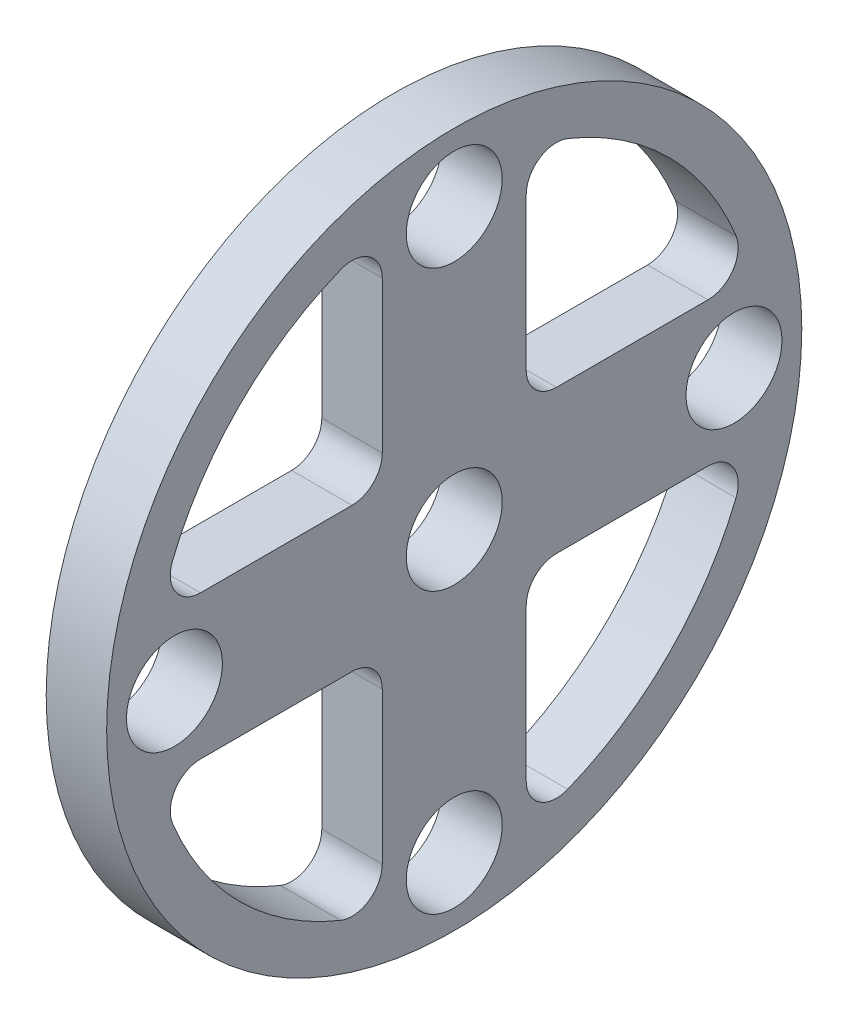
ISO-10303-21;
HEADER;
FILE_DESCRIPTION(('STEP AP214'),'2;1');
FILE_NAME('part.step','',(''),(''),'','','');
FILE_SCHEMA(('AUTOMOTIVE_DESIGN { 1 0 10303 214 1 1 1 1 }'));
ENDSEC;
DATA;
#1=APPLICATION_CONTEXT('core data for automotive mechanical design processes');
#2=APPLICATION_PROTOCOL_DEFINITION('international standard','automotive_design',2000,#1);
#3=PRODUCT_CONTEXT('',#1,'mechanical');
#4=PRODUCT('Part','Part','',(#3));
#5=PRODUCT_RELATED_PRODUCT_CATEGORY('part','',(#4));
#6=PRODUCT_DEFINITION_FORMATION('','',#4);
#7=PRODUCT_DEFINITION_CONTEXT('part definition',#1,'design');
#8=PRODUCT_DEFINITION('design','',#6,#7);
#9=PRODUCT_DEFINITION_SHAPE('','',#8);
#10=(LENGTH_UNIT() NAMED_UNIT(*) SI_UNIT(.MILLI.,.METRE.));
#11=(NAMED_UNIT(*) PLANE_ANGLE_UNIT() SI_UNIT($,.RADIAN.));
#12=(NAMED_UNIT(*) SI_UNIT($,.STERADIAN.) SOLID_ANGLE_UNIT());
#13=UNCERTAINTY_MEASURE_WITH_UNIT(LENGTH_MEASURE(1.E-05),#10,'distance_accuracy_value','');
#14=(GEOMETRIC_REPRESENTATION_CONTEXT(3) GLOBAL_UNCERTAINTY_ASSIGNED_CONTEXT((#13)) GLOBAL_UNIT_ASSIGNED_CONTEXT((#10,
#11,#12)) REPRESENTATION_CONTEXT('',''));
#15=CARTESIAN_POINT('',(0.,0.,0.));
#16=DIRECTION('',(0.,0.,1.));
#17=DIRECTION('',(1.,0.,0.));
#18=AXIS2_PLACEMENT_3D('',#15,#16,#17);
#19=CARTESIAN_POINT('',(4.,0.,0.));
#20=DIRECTION('',(1.,0.,0.));
#21=DIRECTION('',(0.,0.,-1.));
#22=AXIS2_PLACEMENT_3D('',#19,#20,#21);
#23=PLANE('',#22);
#24=CARTESIAN_POINT('',(4.,0.,0.));
#25=DIRECTION('',(1.,0.,0.));
#26=DIRECTION('',(0.,0.,1.));
#27=AXIS2_PLACEMENT_3D('',#24,#25,#26);
#28=CIRCLE('',#27,20.1000000000002);
#29=CARTESIAN_POINT('',(4.,-7.5097375690607,18.6444051029751));
#30=VERTEX_POINT('',#29);
#31=CARTESIAN_POINT('',(4.,-18.6444051029751,7.50973756906036));
#32=VERTEX_POINT('',#31);
#33=EDGE_CURVE('E247',#30,#32,#28,.T.);
#34=ORIENTED_EDGE('',*,*,#33,.F.);
#35=CARTESIAN_POINT('',(4.,-6.76249999999988,16.7892404161118));
#36=DIRECTION('',(1.,0.,0.));
#37=DIRECTION('',(0.,0.,-1.));
#38=AXIS2_PLACEMENT_3D('',#35,#36,#37);
#39=CIRCLE('',#38,2.);
#40=CARTESIAN_POINT('',(4.,-4.76249999999988,16.7892404161118));
#41=VERTEX_POINT('',#40);
#42=EDGE_CURVE('E245',#41,#30,#39,.T.);
#43=ORIENTED_EDGE('',*,*,#42,.F.);
#44=DIRECTION('',(0.,0.,1.));
#45=VECTOR('',#44,1.);
#46=CARTESIAN_POINT('',(4.,-4.76249999999988,16.7892404161118));
#47=LINE('',#46,#45);
#48=CARTESIAN_POINT('',(4.,-4.76249999999995,6.76250000000005));
#49=VERTEX_POINT('',#48);
#50=EDGE_CURVE('E257',#49,#41,#47,.T.);
#51=ORIENTED_EDGE('',*,*,#50,.F.);
#52=CARTESIAN_POINT('',(4.,-6.76249999999995,6.76250000000005));
#53=DIRECTION('',(1.,0.,0.));
#54=DIRECTION('',(0.,0.,-1.));
#55=AXIS2_PLACEMENT_3D('',#52,#53,#54);
#56=CIRCLE('',#55,2.);
#57=CARTESIAN_POINT('',(4.,-6.76249999999998,4.76250000000005));
#58=VERTEX_POINT('',#57);
#59=EDGE_CURVE('E254',#58,#49,#56,.T.);
#60=ORIENTED_EDGE('',*,*,#59,.F.);
#61=DIRECTION('',(0.,1.,0.));
#62=VECTOR('',#61,1.);
#63=CARTESIAN_POINT('',(4.,-6.76249999999998,4.76250000000005));
#64=LINE('',#63,#62);
#65=CARTESIAN_POINT('',(4.,-16.7892404161117,4.76250000000012));
#66=VERTEX_POINT('',#65);
#67=EDGE_CURVE('E252',#66,#58,#64,.T.);
#68=ORIENTED_EDGE('',*,*,#67,.F.);
#69=CARTESIAN_POINT('',(4.,-16.7892404161121,6.76249999999967));
#70=DIRECTION('',(1.,0.,0.));
#71=DIRECTION('',(0.,0.,1.));
#72=AXIS2_PLACEMENT_3D('',#69,#70,#71);
#73=CIRCLE('',#72,1.99999999999984);
#74=EDGE_CURVE('E250',#32,#66,#73,.T.);
#75=ORIENTED_EDGE('',*,*,#74,.F.);
#76=EDGE_LOOP('',(#34,#43,#51,#60,#68,#75));
#77=FACE_BOUND('',#76,.T.);
#78=CARTESIAN_POINT('',(4.,0.,0.));
#79=DIRECTION('',(1.,0.,0.));
#80=DIRECTION('',(0.,0.,1.));
#81=AXIS2_PLACEMENT_3D('',#78,#79,#80);
#82=CIRCLE('',#81,20.1);
#83=CARTESIAN_POINT('',(4.,7.50973756906078,-18.6444051029749));
#84=VERTEX_POINT('',#83);
#85=CARTESIAN_POINT('',(4.,18.6444051029749,-7.50973756906077));
#86=VERTEX_POINT('',#85);
#87=EDGE_CURVE('E337',#84,#86,#82,.T.);
#88=ORIENTED_EDGE('',*,*,#87,.F.);
#89=CARTESIAN_POINT('',(4.,6.7625,-16.7892404161117));
#90=DIRECTION('',(1.,0.,0.));
#91=DIRECTION('',(0.,0.,-1.));
#92=AXIS2_PLACEMENT_3D('',#89,#90,#91);
#93=CIRCLE('',#92,2.);
#94=CARTESIAN_POINT('',(4.,4.7625,-16.7892404161117));
#95=VERTEX_POINT('',#94);
#96=EDGE_CURVE('E335',#95,#84,#93,.T.);
#97=ORIENTED_EDGE('',*,*,#96,.F.);
#98=DIRECTION('',(0.,0.,-1.));
#99=VECTOR('',#98,1.);
#100=CARTESIAN_POINT('',(4.,4.7625,-16.7892404161117));
#101=LINE('',#100,#99);
#102=CARTESIAN_POINT('',(4.,4.7625,-6.76250000000001));
#103=VERTEX_POINT('',#102);
#104=EDGE_CURVE('E347',#103,#95,#101,.T.);
#105=ORIENTED_EDGE('',*,*,#104,.F.);
#106=CARTESIAN_POINT('',(4.,6.7625,-6.7625));
#107=DIRECTION('',(1.,0.,0.));
#108=DIRECTION('',(0.,0.,-1.));
#109=AXIS2_PLACEMENT_3D('',#106,#107,#108);
#110=CIRCLE('',#109,2.);
#111=CARTESIAN_POINT('',(4.,6.76250000000002,-4.7625));
#112=VERTEX_POINT('',#111);
#113=EDGE_CURVE('E344',#112,#103,#110,.T.);
#114=ORIENTED_EDGE('',*,*,#113,.F.);
#115=DIRECTION('',(0.,-1.,0.));
#116=VECTOR('',#115,1.);
#117=CARTESIAN_POINT('',(4.,6.76250000000002,-4.7625));
#118=LINE('',#117,#116);
#119=CARTESIAN_POINT('',(4.,16.7892404161117,-4.7625));
#120=VERTEX_POINT('',#119);
#121=EDGE_CURVE('E342',#120,#112,#118,.T.);
#122=ORIENTED_EDGE('',*,*,#121,.F.);
#123=CARTESIAN_POINT('',(4.,16.7892404161117,-6.7625));
#124=DIRECTION('',(1.,0.,0.));
#125=DIRECTION('',(0.,0.,1.));
#126=AXIS2_PLACEMENT_3D('',#123,#124,#125);
#127=CIRCLE('',#126,2.);
#128=EDGE_CURVE('E340',#86,#120,#127,.T.);
#129=ORIENTED_EDGE('',*,*,#128,.F.);
#130=EDGE_LOOP('',(#88,#97,#105,#114,#122,#129));
#131=FACE_BOUND('',#130,.T.);
#132=CARTESIAN_POINT('',(4.,-18.5125,0.));
#133=DIRECTION('',(1.,0.,0.));
#134=DIRECTION('',(0.,0.,-1.));
#135=AXIS2_PLACEMENT_3D('',#132,#133,#134);
#136=CIRCLE('',#135,3.175);
#137=CARTESIAN_POINT('',(4.,-18.5125,-3.175));
#138=VERTEX_POINT('',#137);
#139=EDGE_CURVE('E386',#138,#138,#136,.T.);
#140=ORIENTED_EDGE('',*,*,#139,.F.);
#141=EDGE_LOOP('',(#140));
#142=FACE_BOUND('',#141,.T.);
#143=CARTESIAN_POINT('',(4.,18.5125,0.));
#144=DIRECTION('',(1.,0.,0.));
#145=DIRECTION('',(0.,0.,-1.));
#146=AXIS2_PLACEMENT_3D('',#143,#144,#145);
#147=CIRCLE('',#146,3.175);
#148=CARTESIAN_POINT('',(4.,18.5125,-3.175));
#149=VERTEX_POINT('',#148);
#150=EDGE_CURVE('E398',#149,#149,#147,.T.);
#151=ORIENTED_EDGE('',*,*,#150,.F.);
#152=EDGE_LOOP('',(#151));
#153=FACE_BOUND('',#152,.T.);
#154=CARTESIAN_POINT('',(4.,0.,0.));
#155=DIRECTION('',(1.,0.,0.));
#156=DIRECTION('',(0.,0.,-1.));
#157=AXIS2_PLACEMENT_3D('',#154,#155,#156);
#158=CIRCLE('',#157,23.);
#159=CARTESIAN_POINT('',(4.,0.,-23.));
#160=VERTEX_POINT('',#159);
#161=EDGE_CURVE('E11',#160,#160,#158,.T.);
#162=ORIENTED_EDGE('',*,*,#161,.T.);
#163=EDGE_LOOP('',(#162));
#164=FACE_BOUND('',#163,.T.);
#165=CARTESIAN_POINT('',(4.,0.,0.));
#166=DIRECTION('',(1.,0.,0.));
#167=DIRECTION('',(0.,0.,-1.));
#168=AXIS2_PLACEMENT_3D('',#165,#166,#167);
#169=CIRCLE('',#168,3.175);
#170=CARTESIAN_POINT('',(4.,0.,-3.17499999999999));
#171=VERTEX_POINT('',#170);
#172=EDGE_CURVE('E404',#171,#171,#169,.T.);
#173=ORIENTED_EDGE('',*,*,#172,.F.);
#174=EDGE_LOOP('',(#173));
#175=FACE_BOUND('',#174,.T.);
#176=CARTESIAN_POINT('',(4.,0.,18.5125));
#177=DIRECTION('',(1.,0.,0.));
#178=DIRECTION('',(0.,0.,-1.));
#179=AXIS2_PLACEMENT_3D('',#176,#177,#178);
#180=CIRCLE('',#179,3.175);
#181=CARTESIAN_POINT('',(4.,0.,15.3375));
#182=VERTEX_POINT('',#181);
#183=EDGE_CURVE('E392',#182,#182,#180,.T.);
#184=ORIENTED_EDGE('',*,*,#183,.F.);
#185=EDGE_LOOP('',(#184));
#186=FACE_BOUND('',#185,.T.);
#187=CARTESIAN_POINT('',(4.,0.,-18.5125));
#188=DIRECTION('',(1.,0.,0.));
#189=DIRECTION('',(0.,0.,-1.));
#190=AXIS2_PLACEMENT_3D('',#187,#188,#189);
#191=CIRCLE('',#190,3.175);
#192=CARTESIAN_POINT('',(4.,0.,-21.6875));
#193=VERTEX_POINT('',#192);
#194=EDGE_CURVE('E380',#193,#193,#191,.T.);
#195=ORIENTED_EDGE('',*,*,#194,.F.);
#196=EDGE_LOOP('',(#195));
#197=FACE_BOUND('',#196,.T.);
#198=CARTESIAN_POINT('',(4.,0.,0.));
#199=DIRECTION('',(1.,0.,0.));
#200=DIRECTION('',(0.,0.,1.));
#201=AXIS2_PLACEMENT_3D('',#198,#199,#200);
#202=CIRCLE('',#201,20.1);
#203=CARTESIAN_POINT('',(4.,-18.6444051029749,-7.50973756906071));
#204=VERTEX_POINT('',#203);
#205=CARTESIAN_POINT('',(4.,-7.50973756906084,-18.6444051029749));
#206=VERTEX_POINT('',#205);
#207=EDGE_CURVE('E292',#204,#206,#202,.T.);
#208=ORIENTED_EDGE('',*,*,#207,.F.);
#209=CARTESIAN_POINT('',(4.,-16.7892404161118,-6.76249999999994));
#210=DIRECTION('',(1.,0.,0.));
#211=DIRECTION('',(0.,0.,-1.));
#212=AXIS2_PLACEMENT_3D('',#209,#210,#211);
#213=CIRCLE('',#212,1.99999999999981);
#214=CARTESIAN_POINT('',(4.,-16.7892404161121,-4.76250000000033));
#215=VERTEX_POINT('',#214);
#216=EDGE_CURVE('E290',#215,#204,#213,.T.);
#217=ORIENTED_EDGE('',*,*,#216,.F.);
#218=DIRECTION('',(0.,-1.,0.));
#219=VECTOR('',#218,1.);
#220=CARTESIAN_POINT('',(4.,-16.7892404161121,-4.76250000000033));
#221=LINE('',#220,#219);
#222=CARTESIAN_POINT('',(4.,-6.76250000000003,-4.76249999999998));
#223=VERTEX_POINT('',#222);
#224=EDGE_CURVE('E302',#223,#215,#221,.T.);
#225=ORIENTED_EDGE('',*,*,#224,.F.);
#226=CARTESIAN_POINT('',(4.,-6.76250000000002,-6.76249999999998));
#227=DIRECTION('',(1.,0.,0.));
#228=DIRECTION('',(0.,0.,-1.));
#229=AXIS2_PLACEMENT_3D('',#226,#227,#228);
#230=CIRCLE('',#229,2.);
#231=CARTESIAN_POINT('',(4.,-4.76250000000002,-6.7625));
#232=VERTEX_POINT('',#231);
#233=EDGE_CURVE('E299',#232,#223,#230,.T.);
#234=ORIENTED_EDGE('',*,*,#233,.F.);
#235=DIRECTION('',(0.,0.,1.));
#236=VECTOR('',#235,1.);
#237=CARTESIAN_POINT('',(4.,-4.76250000000002,-6.7625));
#238=LINE('',#237,#236);
#239=CARTESIAN_POINT('',(4.,-4.76250000000006,-16.7892404161117));
#240=VERTEX_POINT('',#239);
#241=EDGE_CURVE('E297',#240,#232,#238,.T.);
#242=ORIENTED_EDGE('',*,*,#241,.F.);
#243=CARTESIAN_POINT('',(4.,-6.76250000000006,-16.7892404161117));
#244=DIRECTION('',(1.,0.,0.));
#245=DIRECTION('',(0.,0.,1.));
#246=AXIS2_PLACEMENT_3D('',#243,#244,#245);
#247=CIRCLE('',#246,2.);
#248=EDGE_CURVE('E295',#206,#240,#247,.T.);
#249=ORIENTED_EDGE('',*,*,#248,.F.);
#250=EDGE_LOOP('',(#208,#217,#225,#234,#242,#249));
#251=FACE_BOUND('',#250,.T.);
#252=CARTESIAN_POINT('',(4.,0.,0.));
#253=DIRECTION('',(1.,0.,0.));
#254=DIRECTION('',(0.,0.,1.));
#255=AXIS2_PLACEMENT_3D('',#252,#253,#254);
#256=CIRCLE('',#255,20.1);
#257=CARTESIAN_POINT('',(4.,18.644405102975,7.50973756906058));
#258=VERTEX_POINT('',#257);
#259=CARTESIAN_POINT('',(4.,7.50973756906046,18.644405102975));
#260=VERTEX_POINT('',#259);
#261=EDGE_CURVE('E202',#258,#260,#256,.T.);
#262=ORIENTED_EDGE('',*,*,#261,.F.);
#263=CARTESIAN_POINT('',(4.,16.7892404161118,6.76249999999982));
#264=DIRECTION('',(1.,0.,0.));
#265=DIRECTION('',(0.,0.,-1.));
#266=AXIS2_PLACEMENT_3D('',#263,#264,#265);
#267=CIRCLE('',#266,2.);
#268=CARTESIAN_POINT('',(4.,16.7892404161118,4.76249999999982));
#269=VERTEX_POINT('',#268);
#270=EDGE_CURVE('E194',#269,#258,#267,.T.);
#271=ORIENTED_EDGE('',*,*,#270,.F.);
#272=DIRECTION('',(0.,1.,0.));
#273=VECTOR('',#272,1.);
#274=CARTESIAN_POINT('',(4.,16.7892404161118,4.76249999999982));
#275=LINE('',#274,#273);
#276=CARTESIAN_POINT('',(4.,6.76250000000006,4.76249999999993));
#277=VERTEX_POINT('',#276);
#278=EDGE_CURVE('E223',#277,#269,#275,.T.);
#279=ORIENTED_EDGE('',*,*,#278,.F.);
#280=CARTESIAN_POINT('',(4.,6.76250000000007,6.76249999999993));
#281=DIRECTION('',(1.,0.,0.));
#282=DIRECTION('',(0.,0.,-1.));
#283=AXIS2_PLACEMENT_3D('',#280,#281,#282);
#284=CIRCLE('',#283,2.);
#285=CARTESIAN_POINT('',(4.,4.76250000000007,6.76249999999996));
#286=VERTEX_POINT('',#285);
#287=EDGE_CURVE('E221',#286,#277,#284,.T.);
#288=ORIENTED_EDGE('',*,*,#287,.F.);
#289=DIRECTION('',(0.,0.,-1.));
#290=VECTOR('',#289,1.);
#291=CARTESIAN_POINT('',(4.,4.76250000000007,6.76249999999996));
#292=LINE('',#291,#290);
#293=CARTESIAN_POINT('',(4.,4.76250000000018,16.7892404161117));
#294=VERTEX_POINT('',#293);
#295=EDGE_CURVE('E217',#294,#286,#292,.T.);
#296=ORIENTED_EDGE('',*,*,#295,.F.);
#297=CARTESIAN_POINT('',(4.,6.76250000000018,16.7892404161117));
#298=DIRECTION('',(1.,0.,0.));
#299=DIRECTION('',(0.,0.,1.));
#300=AXIS2_PLACEMENT_3D('',#297,#298,#299);
#301=CIRCLE('',#300,2.);
#302=EDGE_CURVE('E215',#260,#294,#301,.T.);
#303=ORIENTED_EDGE('',*,*,#302,.F.);
#304=EDGE_LOOP('',(#262,#271,#279,#288,#296,#303));
#305=FACE_BOUND('',#304,.T.);
#306=ADVANCED_FACE('F33',(#77,#131,#142,#153,#164,#175,#186,#197,#251,#305),#23,.T.);
#307=CARTESIAN_POINT('',(0.,0.,0.));
#308=DIRECTION('',(1.,0.,0.));
#309=DIRECTION('',(0.,0.,-1.));
#310=AXIS2_PLACEMENT_3D('',#307,#308,#309);
#311=PLANE('',#310);
#312=CARTESIAN_POINT('',(0.,-6.76249999999988,16.7892404161118));
#313=DIRECTION('',(1.,0.,0.));
#314=DIRECTION('',(0.,0.,-1.));
#315=AXIS2_PLACEMENT_3D('',#312,#313,#314);
#316=CIRCLE('',#315,2.);
#317=CARTESIAN_POINT('',(0.,-4.76249999999988,16.7892404161118));
#318=VERTEX_POINT('',#317);
#319=CARTESIAN_POINT('',(0.,-7.5097375690607,18.6444051029751));
#320=VERTEX_POINT('',#319);
#321=EDGE_CURVE('E210',#318,#320,#316,.T.);
#322=ORIENTED_EDGE('',*,*,#321,.T.);
#323=CARTESIAN_POINT('',(0.,0.,0.));
#324=DIRECTION('',(1.,0.,0.));
#325=DIRECTION('',(0.,0.,1.));
#326=AXIS2_PLACEMENT_3D('',#323,#324,#325);
#327=CIRCLE('',#326,20.1000000000002);
#328=CARTESIAN_POINT('',(0.,-18.6444051029751,7.50973756906036));
#329=VERTEX_POINT('',#328);
#330=EDGE_CURVE('E262',#320,#329,#327,.T.);
#331=ORIENTED_EDGE('',*,*,#330,.T.);
#332=CARTESIAN_POINT('',(0.,-16.7892404161121,6.76249999999967));
#333=DIRECTION('',(1.,0.,0.));
#334=DIRECTION('',(0.,0.,1.));
#335=AXIS2_PLACEMENT_3D('',#332,#333,#334);
#336=CIRCLE('',#335,1.99999999999984);
#337=CARTESIAN_POINT('',(0.,-16.7892404161117,4.76250000000012));
#338=VERTEX_POINT('',#337);
#339=EDGE_CURVE('E265',#329,#338,#336,.T.);
#340=ORIENTED_EDGE('',*,*,#339,.T.);
#341=DIRECTION('',(0.,1.,0.));
#342=VECTOR('',#341,1.);
#343=CARTESIAN_POINT('',(0.,-6.76249999999998,4.76250000000005));
#344=LINE('',#343,#342);
#345=CARTESIAN_POINT('',(0.,-6.76249999999998,4.76250000000005));
#346=VERTEX_POINT('',#345);
#347=EDGE_CURVE('E268',#338,#346,#344,.T.);
#348=ORIENTED_EDGE('',*,*,#347,.T.);
#349=CARTESIAN_POINT('',(0.,-6.76249999999995,6.76250000000005));
#350=DIRECTION('',(1.,0.,0.));
#351=DIRECTION('',(0.,0.,-1.));
#352=AXIS2_PLACEMENT_3D('',#349,#350,#351);
#353=CIRCLE('',#352,2.);
#354=CARTESIAN_POINT('',(0.,-4.76249999999995,6.76250000000005));
#355=VERTEX_POINT('',#354);
#356=EDGE_CURVE('E271',#346,#355,#353,.T.);
#357=ORIENTED_EDGE('',*,*,#356,.T.);
#358=DIRECTION('',(0.,0.,1.));
#359=VECTOR('',#358,1.);
#360=CARTESIAN_POINT('',(0.,-4.76249999999988,16.7892404161118));
#361=LINE('',#360,#359);
#362=EDGE_CURVE('E248',#355,#318,#361,.T.);
#363=ORIENTED_EDGE('',*,*,#362,.T.);
#364=EDGE_LOOP('',(#322,#331,#340,#348,#357,#363));
#365=FACE_BOUND('',#364,.T.);
#366=CARTESIAN_POINT('',(0.,6.7625,-16.7892404161117));
#367=DIRECTION('',(1.,0.,0.));
#368=DIRECTION('',(0.,0.,-1.));
#369=AXIS2_PLACEMENT_3D('',#366,#367,#368);
#370=CIRCLE('',#369,2.);
#371=CARTESIAN_POINT('',(0.,4.7625,-16.7892404161117));
#372=VERTEX_POINT('',#371);
#373=CARTESIAN_POINT('',(0.,7.50973756906078,-18.6444051029749));
#374=VERTEX_POINT('',#373);
#375=EDGE_CURVE('E334',#372,#374,#370,.T.);
#376=ORIENTED_EDGE('',*,*,#375,.T.);
#377=CARTESIAN_POINT('',(0.,0.,0.));
#378=DIRECTION('',(1.,0.,0.));
#379=DIRECTION('',(0.,0.,1.));
#380=AXIS2_PLACEMENT_3D('',#377,#378,#379);
#381=CIRCLE('',#380,20.1);
#382=CARTESIAN_POINT('',(0.,18.6444051029749,-7.50973756906077));
#383=VERTEX_POINT('',#382);
#384=EDGE_CURVE('E352',#374,#383,#381,.T.);
#385=ORIENTED_EDGE('',*,*,#384,.T.);
#386=CARTESIAN_POINT('',(0.,16.7892404161117,-6.7625));
#387=DIRECTION('',(1.,0.,0.));
#388=DIRECTION('',(0.,0.,1.));
#389=AXIS2_PLACEMENT_3D('',#386,#387,#388);
#390=CIRCLE('',#389,2.);
#391=CARTESIAN_POINT('',(0.,16.7892404161117,-4.7625));
#392=VERTEX_POINT('',#391);
#393=EDGE_CURVE('E355',#383,#392,#390,.T.);
#394=ORIENTED_EDGE('',*,*,#393,.T.);
#395=DIRECTION('',(0.,-1.,0.));
#396=VECTOR('',#395,1.);
#397=CARTESIAN_POINT('',(0.,6.76250000000002,-4.7625));
#398=LINE('',#397,#396);
#399=CARTESIAN_POINT('',(0.,6.76250000000002,-4.7625));
#400=VERTEX_POINT('',#399);
#401=EDGE_CURVE('E358',#392,#400,#398,.T.);
#402=ORIENTED_EDGE('',*,*,#401,.T.);
#403=CARTESIAN_POINT('',(0.,6.7625,-6.7625));
#404=DIRECTION('',(1.,0.,0.));
#405=DIRECTION('',(0.,0.,-1.));
#406=AXIS2_PLACEMENT_3D('',#403,#404,#405);
#407=CIRCLE('',#406,2.);
#408=CARTESIAN_POINT('',(0.,4.7625,-6.76250000000001));
#409=VERTEX_POINT('',#408);
#410=EDGE_CURVE('E361',#400,#409,#407,.T.);
#411=ORIENTED_EDGE('',*,*,#410,.T.);
#412=DIRECTION('',(0.,0.,-1.));
#413=VECTOR('',#412,1.);
#414=CARTESIAN_POINT('',(0.,4.7625,-16.7892404161117));
#415=LINE('',#414,#413);
#416=EDGE_CURVE('E338',#409,#372,#415,.T.);
#417=ORIENTED_EDGE('',*,*,#416,.T.);
#418=EDGE_LOOP('',(#376,#385,#394,#402,#411,#417));
#419=FACE_BOUND('',#418,.T.);
#420=CARTESIAN_POINT('',(0.,-18.5125,0.));
#421=DIRECTION('',(1.,0.,0.));
#422=DIRECTION('',(0.,0.,-1.));
#423=AXIS2_PLACEMENT_3D('',#420,#421,#422);
#424=CIRCLE('',#423,3.175);
#425=CARTESIAN_POINT('',(0.,-18.5125,-3.175));
#426=VERTEX_POINT('',#425);
#427=EDGE_CURVE('E383',#426,#426,#424,.T.);
#428=ORIENTED_EDGE('',*,*,#427,.T.);
#429=EDGE_LOOP('',(#428));
#430=FACE_BOUND('',#429,.T.);
#431=CARTESIAN_POINT('',(0.,18.5125,0.));
#432=DIRECTION('',(1.,0.,0.));
#433=DIRECTION('',(0.,0.,-1.));
#434=AXIS2_PLACEMENT_3D('',#431,#432,#433);
#435=CIRCLE('',#434,3.175);
#436=CARTESIAN_POINT('',(0.,18.5125,-3.175));
#437=VERTEX_POINT('',#436);
#438=EDGE_CURVE('E395',#437,#437,#435,.T.);
#439=ORIENTED_EDGE('',*,*,#438,.T.);
#440=EDGE_LOOP('',(#439));
#441=FACE_BOUND('',#440,.T.);
#442=CARTESIAN_POINT('',(0.,0.,0.));
#443=DIRECTION('',(1.,0.,0.));
#444=DIRECTION('',(0.,0.,-1.));
#445=AXIS2_PLACEMENT_3D('',#442,#443,#444);
#446=CIRCLE('',#445,23.);
#447=CARTESIAN_POINT('',(0.,0.,-23.));
#448=VERTEX_POINT('',#447);
#449=EDGE_CURVE('E37',#448,#448,#446,.T.);
#450=ORIENTED_EDGE('',*,*,#449,.F.);
#451=EDGE_LOOP('',(#450));
#452=FACE_BOUND('',#451,.T.);
#453=CARTESIAN_POINT('',(0.,0.,0.));
#454=DIRECTION('',(1.,0.,0.));
#455=DIRECTION('',(0.,0.,-1.));
#456=AXIS2_PLACEMENT_3D('',#453,#454,#455);
#457=CIRCLE('',#456,3.175);
#458=CARTESIAN_POINT('',(0.,0.,-3.17499999999999));
#459=VERTEX_POINT('',#458);
#460=EDGE_CURVE('E401',#459,#459,#457,.T.);
#461=ORIENTED_EDGE('',*,*,#460,.T.);
#462=EDGE_LOOP('',(#461));
#463=FACE_BOUND('',#462,.T.);
#464=CARTESIAN_POINT('',(0.,0.,18.5125));
#465=DIRECTION('',(1.,0.,0.));
#466=DIRECTION('',(0.,0.,-1.));
#467=AXIS2_PLACEMENT_3D('',#464,#465,#466);
#468=CIRCLE('',#467,3.175);
#469=CARTESIAN_POINT('',(0.,0.,15.3375));
#470=VERTEX_POINT('',#469);
#471=EDGE_CURVE('E389',#470,#470,#468,.T.);
#472=ORIENTED_EDGE('',*,*,#471,.T.);
#473=EDGE_LOOP('',(#472));
#474=FACE_BOUND('',#473,.T.);
#475=CARTESIAN_POINT('',(0.,0.,-18.5125));
#476=DIRECTION('',(1.,0.,0.));
#477=DIRECTION('',(0.,0.,-1.));
#478=AXIS2_PLACEMENT_3D('',#475,#476,#477);
#479=CIRCLE('',#478,3.175);
#480=CARTESIAN_POINT('',(0.,0.,-21.6875));
#481=VERTEX_POINT('',#480);
#482=EDGE_CURVE('E379',#481,#481,#479,.T.);
#483=ORIENTED_EDGE('',*,*,#482,.T.);
#484=EDGE_LOOP('',(#483));
#485=FACE_BOUND('',#484,.T.);
#486=CARTESIAN_POINT('',(0.,-16.7892404161118,-6.76249999999994));
#487=DIRECTION('',(1.,0.,0.));
#488=DIRECTION('',(0.,0.,-1.));
#489=AXIS2_PLACEMENT_3D('',#486,#487,#488);
#490=CIRCLE('',#489,1.99999999999981);
#491=CARTESIAN_POINT('',(0.,-16.7892404161121,-4.76250000000033));
#492=VERTEX_POINT('',#491);
#493=CARTESIAN_POINT('',(0.,-18.6444051029749,-7.50973756906071));
#494=VERTEX_POINT('',#493);
#495=EDGE_CURVE('E289',#492,#494,#490,.T.);
#496=ORIENTED_EDGE('',*,*,#495,.T.);
#497=CARTESIAN_POINT('',(0.,0.,0.));
#498=DIRECTION('',(1.,0.,0.));
#499=DIRECTION('',(0.,0.,1.));
#500=AXIS2_PLACEMENT_3D('',#497,#498,#499);
#501=CIRCLE('',#500,20.1);
#502=CARTESIAN_POINT('',(0.,-7.50973756906084,-18.6444051029749));
#503=VERTEX_POINT('',#502);
#504=EDGE_CURVE('E307',#494,#503,#501,.T.);
#505=ORIENTED_EDGE('',*,*,#504,.T.);
#506=CARTESIAN_POINT('',(0.,-6.76250000000006,-16.7892404161117));
#507=DIRECTION('',(1.,0.,0.));
#508=DIRECTION('',(0.,0.,1.));
#509=AXIS2_PLACEMENT_3D('',#506,#507,#508);
#510=CIRCLE('',#509,2.);
#511=CARTESIAN_POINT('',(0.,-4.76250000000006,-16.7892404161117));
#512=VERTEX_POINT('',#511);
#513=EDGE_CURVE('E310',#503,#512,#510,.T.);
#514=ORIENTED_EDGE('',*,*,#513,.T.);
#515=DIRECTION('',(0.,0.,1.));
#516=VECTOR('',#515,1.);
#517=CARTESIAN_POINT('',(0.,-4.76250000000002,-6.7625));
#518=LINE('',#517,#516);
#519=CARTESIAN_POINT('',(0.,-4.76250000000002,-6.7625));
#520=VERTEX_POINT('',#519);
#521=EDGE_CURVE('E313',#512,#520,#518,.T.);
#522=ORIENTED_EDGE('',*,*,#521,.T.);
#523=CARTESIAN_POINT('',(0.,-6.76250000000002,-6.76249999999998));
#524=DIRECTION('',(1.,0.,0.));
#525=DIRECTION('',(0.,0.,-1.));
#526=AXIS2_PLACEMENT_3D('',#523,#524,#525);
#527=CIRCLE('',#526,2.);
#528=CARTESIAN_POINT('',(0.,-6.76250000000003,-4.76249999999998));
#529=VERTEX_POINT('',#528);
#530=EDGE_CURVE('E316',#520,#529,#527,.T.);
#531=ORIENTED_EDGE('',*,*,#530,.T.);
#532=DIRECTION('',(0.,-1.,0.));
#533=VECTOR('',#532,1.);
#534=CARTESIAN_POINT('',(0.,-16.7892404161121,-4.76250000000033));
#535=LINE('',#534,#533);
#536=EDGE_CURVE('E293',#529,#492,#535,.T.);
#537=ORIENTED_EDGE('',*,*,#536,.T.);
#538=EDGE_LOOP('',(#496,#505,#514,#522,#531,#537));
#539=FACE_BOUND('',#538,.T.);
#540=CARTESIAN_POINT('',(0.,16.7892404161118,6.76249999999982));
#541=DIRECTION('',(1.,0.,0.));
#542=DIRECTION('',(0.,0.,-1.));
#543=AXIS2_PLACEMENT_3D('',#540,#541,#542);
#544=CIRCLE('',#543,2.);
#545=CARTESIAN_POINT('',(0.,16.7892404161118,4.76249999999982));
#546=VERTEX_POINT('',#545);
#547=CARTESIAN_POINT('',(0.,18.644405102975,7.50973756906058));
#548=VERTEX_POINT('',#547);
#549=EDGE_CURVE('E56',#546,#548,#544,.T.);
#550=ORIENTED_EDGE('',*,*,#549,.T.);
#551=CARTESIAN_POINT('',(0.,0.,0.));
#552=DIRECTION('',(1.,0.,0.));
#553=DIRECTION('',(0.,0.,1.));
#554=AXIS2_PLACEMENT_3D('',#551,#552,#553);
#555=CIRCLE('',#554,20.1);
#556=CARTESIAN_POINT('',(0.,7.50973756906046,18.644405102975));
#557=VERTEX_POINT('',#556);
#558=EDGE_CURVE('E209',#548,#557,#555,.T.);
#559=ORIENTED_EDGE('',*,*,#558,.T.);
#560=CARTESIAN_POINT('',(0.,6.76250000000018,16.7892404161117));
#561=DIRECTION('',(1.,0.,0.));
#562=DIRECTION('',(0.,0.,1.));
#563=AXIS2_PLACEMENT_3D('',#560,#561,#562);
#564=CIRCLE('',#563,2.);
#565=CARTESIAN_POINT('',(0.,4.76250000000018,16.7892404161117));
#566=VERTEX_POINT('',#565);
#567=EDGE_CURVE('E227',#557,#566,#564,.T.);
#568=ORIENTED_EDGE('',*,*,#567,.T.);
#569=DIRECTION('',(0.,0.,-1.));
#570=VECTOR('',#569,1.);
#571=CARTESIAN_POINT('',(0.,4.76250000000007,6.76249999999996));
#572=LINE('',#571,#570);
#573=CARTESIAN_POINT('',(0.,4.76250000000007,6.76249999999996));
#574=VERTEX_POINT('',#573);
#575=EDGE_CURVE('E230',#566,#574,#572,.T.);
#576=ORIENTED_EDGE('',*,*,#575,.T.);
#577=CARTESIAN_POINT('',(0.,6.76250000000007,6.76249999999993));
#578=DIRECTION('',(1.,0.,0.));
#579=DIRECTION('',(0.,0.,-1.));
#580=AXIS2_PLACEMENT_3D('',#577,#578,#579);
#581=CIRCLE('',#580,2.);
#582=CARTESIAN_POINT('',(0.,6.76250000000006,4.76249999999993));
#583=VERTEX_POINT('',#582);
#584=EDGE_CURVE('E233',#574,#583,#581,.T.);
#585=ORIENTED_EDGE('',*,*,#584,.T.);
#586=DIRECTION('',(0.,1.,0.));
#587=VECTOR('',#586,1.);
#588=CARTESIAN_POINT('',(0.,16.7892404161118,4.76249999999982));
#589=LINE('',#588,#587);
#590=EDGE_CURVE('E203',#583,#546,#589,.T.);
#591=ORIENTED_EDGE('',*,*,#590,.T.);
#592=EDGE_LOOP('',(#550,#559,#568,#576,#585,#591));
#593=FACE_BOUND('',#592,.T.);
#594=ADVANCED_FACE('F410',(#365,#419,#430,#441,#452,#463,#474,#485,#539,#593),#311,.F.);
#595=CARTESIAN_POINT('',(4.,0.,0.));
#596=DIRECTION('',(-1.,0.,0.));
#597=DIRECTION('',(0.,0.,1.));
#598=AXIS2_PLACEMENT_3D('',#595,#596,#597);
#599=CYLINDRICAL_SURFACE('',#598,23.);
#600=ORIENTED_EDGE('',*,*,#161,.F.);
#601=EDGE_LOOP('',(#600));
#602=FACE_BOUND('',#601,.T.);
#603=ORIENTED_EDGE('',*,*,#449,.T.);
#604=EDGE_LOOP('',(#603));
#605=FACE_BOUND('',#604,.T.);
#606=ADVANCED_FACE('F35',(#602,#605),#599,.T.);
#607=CARTESIAN_POINT('',(4.,0.,0.));
#608=DIRECTION('',(-1.,0.,0.));
#609=DIRECTION('',(0.,0.,1.));
#610=AXIS2_PLACEMENT_3D('',#607,#608,#609);
#611=CYLINDRICAL_SURFACE('',#610,3.175);
#612=ORIENTED_EDGE('',*,*,#172,.T.);
#613=EDGE_LOOP('',(#612));
#614=FACE_BOUND('',#613,.T.);
#615=ORIENTED_EDGE('',*,*,#460,.F.);
#616=EDGE_LOOP('',(#615));
#617=FACE_BOUND('',#616,.T.);
#618=ADVANCED_FACE('F413',(#614,#617),#611,.F.);
#619=CARTESIAN_POINT('',(4.,18.5125,0.));
#620=DIRECTION('',(-1.,0.,0.));
#621=DIRECTION('',(0.,0.,1.));
#622=AXIS2_PLACEMENT_3D('',#619,#620,#621);
#623=CYLINDRICAL_SURFACE('',#622,3.175);
#624=ORIENTED_EDGE('',*,*,#150,.T.);
#625=EDGE_LOOP('',(#624));
#626=FACE_BOUND('',#625,.T.);
#627=ORIENTED_EDGE('',*,*,#438,.F.);
#628=EDGE_LOOP('',(#627));
#629=FACE_BOUND('',#628,.T.);
#630=ADVANCED_FACE('F415',(#626,#629),#623,.F.);
#631=CARTESIAN_POINT('',(4.,0.,18.5125));
#632=DIRECTION('',(-1.,0.,0.));
#633=DIRECTION('',(0.,0.,1.));
#634=AXIS2_PLACEMENT_3D('',#631,#632,#633);
#635=CYLINDRICAL_SURFACE('',#634,3.175);
#636=ORIENTED_EDGE('',*,*,#183,.T.);
#637=EDGE_LOOP('',(#636));
#638=FACE_BOUND('',#637,.T.);
#639=ORIENTED_EDGE('',*,*,#471,.F.);
#640=EDGE_LOOP('',(#639));
#641=FACE_BOUND('',#640,.T.);
#642=ADVANCED_FACE('F422',(#638,#641),#635,.F.);
#643=CARTESIAN_POINT('',(4.,-18.5125,0.));
#644=DIRECTION('',(-1.,0.,0.));
#645=DIRECTION('',(0.,0.,1.));
#646=AXIS2_PLACEMENT_3D('',#643,#644,#645);
#647=CYLINDRICAL_SURFACE('',#646,3.175);
#648=ORIENTED_EDGE('',*,*,#139,.T.);
#649=EDGE_LOOP('',(#648));
#650=FACE_BOUND('',#649,.T.);
#651=ORIENTED_EDGE('',*,*,#427,.F.);
#652=EDGE_LOOP('',(#651));
#653=FACE_BOUND('',#652,.T.);
#654=ADVANCED_FACE('F523',(#650,#653),#647,.F.);
#655=CARTESIAN_POINT('',(4.,0.,-18.5125));
#656=DIRECTION('',(-1.,0.,0.));
#657=DIRECTION('',(0.,0.,1.));
#658=AXIS2_PLACEMENT_3D('',#655,#656,#657);
#659=CYLINDRICAL_SURFACE('',#658,3.175);
#660=ORIENTED_EDGE('',*,*,#194,.T.);
#661=EDGE_LOOP('',(#660));
#662=FACE_BOUND('',#661,.T.);
#663=ORIENTED_EDGE('',*,*,#482,.F.);
#664=EDGE_LOOP('',(#663));
#665=FACE_BOUND('',#664,.T.);
#666=ADVANCED_FACE('F519',(#662,#665),#659,.F.);
#667=CARTESIAN_POINT('',(4.,6.7625,-16.7892404161117));
#668=DIRECTION('',(-1.,0.,0.));
#669=DIRECTION('',(0.,0.,1.));
#670=AXIS2_PLACEMENT_3D('',#667,#668,#669);
#671=CYLINDRICAL_SURFACE('',#670,2.);
#672=ORIENTED_EDGE('',*,*,#375,.F.);
#673=DIRECTION('',(-1.,0.,0.));
#674=VECTOR('',#673,1.);
#675=CARTESIAN_POINT('',(4.,4.7625,-16.7892404161117));
#676=LINE('',#675,#674);
#677=EDGE_CURVE('E349',#95,#372,#676,.T.);
#678=ORIENTED_EDGE('',*,*,#677,.F.);
#679=ORIENTED_EDGE('',*,*,#96,.T.);
#680=DIRECTION('',(-1.,0.,0.));
#681=VECTOR('',#680,1.);
#682=CARTESIAN_POINT('',(4.,7.50973756906078,-18.6444051029749));
#683=LINE('',#682,#681);
#684=EDGE_CURVE('E376',#84,#374,#683,.T.);
#685=ORIENTED_EDGE('',*,*,#684,.T.);
#686=EDGE_LOOP('',(#672,#678,#679,#685));
#687=FACE_BOUND('',#686,.T.);
#688=ADVANCED_FACE('F515',(#687),#671,.F.);
#689=CARTESIAN_POINT('',(4.,0.,0.));
#690=DIRECTION('',(-1.,0.,0.));
#691=DIRECTION('',(0.,0.,1.));
#692=AXIS2_PLACEMENT_3D('',#689,#690,#691);
#693=CYLINDRICAL_SURFACE('',#692,20.1);
#694=ORIENTED_EDGE('',*,*,#384,.F.);
#695=ORIENTED_EDGE('',*,*,#684,.F.);
#696=ORIENTED_EDGE('',*,*,#87,.T.);
#697=DIRECTION('',(-1.,0.,0.));
#698=VECTOR('',#697,1.);
#699=CARTESIAN_POINT('',(4.,18.6444051029749,-7.50973756906077));
#700=LINE('',#699,#698);
#701=EDGE_CURVE('E374',#86,#383,#700,.T.);
#702=ORIENTED_EDGE('',*,*,#701,.T.);
#703=EDGE_LOOP('',(#694,#695,#696,#702));
#704=FACE_BOUND('',#703,.T.);
#705=ADVANCED_FACE('F511',(#704),#693,.F.);
#706=CARTESIAN_POINT('',(4.,16.7892404161117,-6.7625));
#707=DIRECTION('',(-1.,0.,0.));
#708=DIRECTION('',(0.,0.,1.));
#709=AXIS2_PLACEMENT_3D('',#706,#707,#708);
#710=CYLINDRICAL_SURFACE('',#709,2.);
#711=ORIENTED_EDGE('',*,*,#393,.F.);
#712=ORIENTED_EDGE('',*,*,#701,.F.);
#713=ORIENTED_EDGE('',*,*,#128,.T.);
#714=DIRECTION('',(-1.,0.,0.));
#715=VECTOR('',#714,1.);
#716=CARTESIAN_POINT('',(4.,16.7892404161117,-4.7625));
#717=LINE('',#716,#715);
#718=EDGE_CURVE('E372',#120,#392,#717,.T.);
#719=ORIENTED_EDGE('',*,*,#718,.T.);
#720=EDGE_LOOP('',(#711,#712,#713,#719));
#721=FACE_BOUND('',#720,.T.);
#722=ADVANCED_FACE('F507',(#721),#710,.F.);
#723=CARTESIAN_POINT('',(4.,6.76250000000002,-4.7625));
#724=DIRECTION('',(0.,0.,-1.));
#725=DIRECTION('',(-1.,0.,0.));
#726=AXIS2_PLACEMENT_3D('',#723,#724,#725);
#727=PLANE('',#726);
#728=ORIENTED_EDGE('',*,*,#401,.F.);
#729=ORIENTED_EDGE('',*,*,#718,.F.);
#730=ORIENTED_EDGE('',*,*,#121,.T.);
#731=DIRECTION('',(-1.,0.,0.));
#732=VECTOR('',#731,1.);
#733=CARTESIAN_POINT('',(4.,6.76250000000002,-4.7625));
#734=LINE('',#733,#732);
#735=EDGE_CURVE('E370',#112,#400,#734,.T.);
#736=ORIENTED_EDGE('',*,*,#735,.T.);
#737=EDGE_LOOP('',(#728,#729,#730,#736));
#738=FACE_BOUND('',#737,.T.);
#739=ADVANCED_FACE('F503',(#738),#727,.T.);
#740=CARTESIAN_POINT('',(4.,6.7625,-6.7625));
#741=DIRECTION('',(-1.,0.,0.));
#742=DIRECTION('',(0.,0.,1.));
#743=AXIS2_PLACEMENT_3D('',#740,#741,#742);
#744=CYLINDRICAL_SURFACE('',#743,2.);
#745=ORIENTED_EDGE('',*,*,#410,.F.);
#746=ORIENTED_EDGE('',*,*,#735,.F.);
#747=ORIENTED_EDGE('',*,*,#113,.T.);
#748=DIRECTION('',(-1.,0.,0.));
#749=VECTOR('',#748,1.);
#750=CARTESIAN_POINT('',(4.,4.7625,-6.76250000000001));
#751=LINE('',#750,#749);
#752=EDGE_CURVE('E368',#103,#409,#751,.T.);
#753=ORIENTED_EDGE('',*,*,#752,.T.);
#754=EDGE_LOOP('',(#745,#746,#747,#753));
#755=FACE_BOUND('',#754,.T.);
#756=ADVANCED_FACE('F499',(#755),#744,.F.);
#757=CARTESIAN_POINT('',(4.,4.7625,-16.7892404161117));
#758=DIRECTION('',(0.,1.,0.));
#759=DIRECTION('',(0.,0.,1.));
#760=AXIS2_PLACEMENT_3D('',#757,#758,#759);
#761=PLANE('',#760);
#762=ORIENTED_EDGE('',*,*,#416,.F.);
#763=ORIENTED_EDGE('',*,*,#752,.F.);
#764=ORIENTED_EDGE('',*,*,#104,.T.);
#765=ORIENTED_EDGE('',*,*,#677,.T.);
#766=EDGE_LOOP('',(#762,#763,#764,#765));
#767=FACE_BOUND('',#766,.T.);
#768=ADVANCED_FACE('F496',(#767),#761,.T.);
#769=CARTESIAN_POINT('',(4.,-16.7892404161118,-6.76249999999994));
#770=DIRECTION('',(-1.,0.,0.));
#771=DIRECTION('',(0.,0.,1.));
#772=AXIS2_PLACEMENT_3D('',#769,#770,#771);
#773=CYLINDRICAL_SURFACE('',#772,1.99999999999981);
#774=ORIENTED_EDGE('',*,*,#495,.F.);
#775=DIRECTION('',(-1.,0.,0.));
#776=VECTOR('',#775,1.);
#777=CARTESIAN_POINT('',(4.,-16.7892404161121,-4.76250000000033));
#778=LINE('',#777,#776);
#779=EDGE_CURVE('E304',#215,#492,#778,.T.);
#780=ORIENTED_EDGE('',*,*,#779,.F.);
#781=ORIENTED_EDGE('',*,*,#216,.T.);
#782=DIRECTION('',(-1.,0.,0.));
#783=VECTOR('',#782,1.);
#784=CARTESIAN_POINT('',(4.,-18.6444051029749,-7.50973756906071));
#785=LINE('',#784,#783);
#786=EDGE_CURVE('E331',#204,#494,#785,.T.);
#787=ORIENTED_EDGE('',*,*,#786,.T.);
#788=EDGE_LOOP('',(#774,#780,#781,#787));
#789=FACE_BOUND('',#788,.T.);
#790=ADVANCED_FACE('F470',(#789),#773,.F.);
#791=CARTESIAN_POINT('',(4.,0.,0.));
#792=DIRECTION('',(-1.,0.,0.));
#793=DIRECTION('',(0.,0.,1.));
#794=AXIS2_PLACEMENT_3D('',#791,#792,#793);
#795=CYLINDRICAL_SURFACE('',#794,20.1);
#796=ORIENTED_EDGE('',*,*,#504,.F.);
#797=ORIENTED_EDGE('',*,*,#786,.F.);
#798=ORIENTED_EDGE('',*,*,#207,.T.);
#799=DIRECTION('',(-1.,0.,0.));
#800=VECTOR('',#799,1.);
#801=CARTESIAN_POINT('',(4.,-7.50973756906084,-18.6444051029749));
#802=LINE('',#801,#800);
#803=EDGE_CURVE('E329',#206,#503,#802,.T.);
#804=ORIENTED_EDGE('',*,*,#803,.T.);
#805=EDGE_LOOP('',(#796,#797,#798,#804));
#806=FACE_BOUND('',#805,.T.);
#807=ADVANCED_FACE('F461',(#806),#795,.F.);
#808=CARTESIAN_POINT('',(4.,-6.76250000000006,-16.7892404161117));
#809=DIRECTION('',(-1.,0.,0.));
#810=DIRECTION('',(0.,0.,1.));
#811=AXIS2_PLACEMENT_3D('',#808,#809,#810);
#812=CYLINDRICAL_SURFACE('',#811,2.);
#813=ORIENTED_EDGE('',*,*,#513,.F.);
#814=ORIENTED_EDGE('',*,*,#803,.F.);
#815=ORIENTED_EDGE('',*,*,#248,.T.);
#816=DIRECTION('',(-1.,0.,0.));
#817=VECTOR('',#816,1.);
#818=CARTESIAN_POINT('',(4.,-4.76250000000006,-16.7892404161117));
#819=LINE('',#818,#817);
#820=EDGE_CURVE('E327',#240,#512,#819,.T.);
#821=ORIENTED_EDGE('',*,*,#820,.T.);
#822=EDGE_LOOP('',(#813,#814,#815,#821));
#823=FACE_BOUND('',#822,.T.);
#824=ADVANCED_FACE('F464',(#823),#812,.F.);
#825=CARTESIAN_POINT('',(4.,-4.76250000000002,-6.7625));
#826=DIRECTION('',(0.,-1.,0.));
#827=DIRECTION('',(0.,0.,-1.));
#828=AXIS2_PLACEMENT_3D('',#825,#826,#827);
#829=PLANE('',#828);
#830=ORIENTED_EDGE('',*,*,#521,.F.);
#831=ORIENTED_EDGE('',*,*,#820,.F.);
#832=ORIENTED_EDGE('',*,*,#241,.T.);
#833=DIRECTION('',(-1.,0.,0.));
#834=VECTOR('',#833,1.);
#835=CARTESIAN_POINT('',(4.,-4.76250000000002,-6.7625));
#836=LINE('',#835,#834);
#837=EDGE_CURVE('E325',#232,#520,#836,.T.);
#838=ORIENTED_EDGE('',*,*,#837,.T.);
#839=EDGE_LOOP('',(#830,#831,#832,#838));
#840=FACE_BOUND('',#839,.T.);
#841=ADVANCED_FACE('F481',(#840),#829,.T.);
#842=CARTESIAN_POINT('',(4.,-6.76250000000002,-6.76249999999998));
#843=DIRECTION('',(-1.,0.,0.));
#844=DIRECTION('',(0.,0.,1.));
#845=AXIS2_PLACEMENT_3D('',#842,#843,#844);
#846=CYLINDRICAL_SURFACE('',#845,2.);
#847=ORIENTED_EDGE('',*,*,#530,.F.);
#848=ORIENTED_EDGE('',*,*,#837,.F.);
#849=ORIENTED_EDGE('',*,*,#233,.T.);
#850=DIRECTION('',(-1.,0.,0.));
#851=VECTOR('',#850,1.);
#852=CARTESIAN_POINT('',(4.,-6.76250000000003,-4.76249999999998));
#853=LINE('',#852,#851);
#854=EDGE_CURVE('E323',#223,#529,#853,.T.);
#855=ORIENTED_EDGE('',*,*,#854,.T.);
#856=EDGE_LOOP('',(#847,#848,#849,#855));
#857=FACE_BOUND('',#856,.T.);
#858=ADVANCED_FACE('F478',(#857),#846,.F.);
#859=CARTESIAN_POINT('',(4.,-16.7892404161121,-4.76250000000033));
#860=DIRECTION('',(0.,0.,-1.));
#861=DIRECTION('',(0.,1.,0.));
#862=AXIS2_PLACEMENT_3D('',#859,#860,#861);
#863=PLANE('',#862);
#864=ORIENTED_EDGE('',*,*,#536,.F.);
#865=ORIENTED_EDGE('',*,*,#854,.F.);
#866=ORIENTED_EDGE('',*,*,#224,.T.);
#867=ORIENTED_EDGE('',*,*,#779,.T.);
#868=EDGE_LOOP('',(#864,#865,#866,#867));
#869=FACE_BOUND('',#868,.T.);
#870=ADVANCED_FACE('F474',(#869),#863,.T.);
#871=CARTESIAN_POINT('',(4.,-6.76249999999988,16.7892404161118));
#872=DIRECTION('',(-1.,0.,0.));
#873=DIRECTION('',(0.,0.,1.));
#874=AXIS2_PLACEMENT_3D('',#871,#872,#873);
#875=CYLINDRICAL_SURFACE('',#874,2.);
#876=ORIENTED_EDGE('',*,*,#321,.F.);
#877=DIRECTION('',(-1.,0.,0.));
#878=VECTOR('',#877,1.);
#879=CARTESIAN_POINT('',(4.,-4.76249999999988,16.7892404161118));
#880=LINE('',#879,#878);
#881=EDGE_CURVE('E259',#41,#318,#880,.T.);
#882=ORIENTED_EDGE('',*,*,#881,.F.);
#883=ORIENTED_EDGE('',*,*,#42,.T.);
#884=DIRECTION('',(-1.,0.,0.));
#885=VECTOR('',#884,1.);
#886=CARTESIAN_POINT('',(4.,-7.5097375690607,18.6444051029751));
#887=LINE('',#886,#885);
#888=EDGE_CURVE('E286',#30,#320,#887,.T.);
#889=ORIENTED_EDGE('',*,*,#888,.T.);
#890=EDGE_LOOP('',(#876,#882,#883,#889));
#891=FACE_BOUND('',#890,.T.);
#892=ADVANCED_FACE('F602',(#891),#875,.F.);
#893=CARTESIAN_POINT('',(4.,0.,0.));
#894=DIRECTION('',(-1.,0.,0.));
#895=DIRECTION('',(0.,0.,1.));
#896=AXIS2_PLACEMENT_3D('',#893,#894,#895);
#897=CYLINDRICAL_SURFACE('',#896,20.1000000000002);
#898=ORIENTED_EDGE('',*,*,#330,.F.);
#899=ORIENTED_EDGE('',*,*,#888,.F.);
#900=ORIENTED_EDGE('',*,*,#33,.T.);
#901=DIRECTION('',(-1.,0.,0.));
#902=VECTOR('',#901,1.);
#903=CARTESIAN_POINT('',(4.,-18.6444051029751,7.50973756906036));
#904=LINE('',#903,#902);
#905=EDGE_CURVE('E284',#32,#329,#904,.T.);
#906=ORIENTED_EDGE('',*,*,#905,.T.);
#907=EDGE_LOOP('',(#898,#899,#900,#906));
#908=FACE_BOUND('',#907,.T.);
#909=ADVANCED_FACE('F610',(#908),#897,.F.);
#910=CARTESIAN_POINT('',(4.,-16.7892404161121,6.76249999999967));
#911=DIRECTION('',(-1.,0.,0.));
#912=DIRECTION('',(0.,0.,1.));
#913=AXIS2_PLACEMENT_3D('',#910,#911,#912);
#914=CYLINDRICAL_SURFACE('',#913,1.99999999999984);
#915=ORIENTED_EDGE('',*,*,#339,.F.);
#916=ORIENTED_EDGE('',*,*,#905,.F.);
#917=ORIENTED_EDGE('',*,*,#74,.T.);
#918=DIRECTION('',(-1.,0.,0.));
#919=VECTOR('',#918,1.);
#920=CARTESIAN_POINT('',(4.,-16.7892404161117,4.76250000000012));
#921=LINE('',#920,#919);
#922=EDGE_CURVE('E282',#66,#338,#921,.T.);
#923=ORIENTED_EDGE('',*,*,#922,.T.);
#924=EDGE_LOOP('',(#915,#916,#917,#923));
#925=FACE_BOUND('',#924,.T.);
#926=ADVANCED_FACE('F620',(#925),#914,.F.);
#927=CARTESIAN_POINT('',(4.,-6.76249999999998,4.76250000000005));
#928=DIRECTION('',(0.,0.,1.));
#929=DIRECTION('',(0.,-1.,0.));
#930=AXIS2_PLACEMENT_3D('',#927,#928,#929);
#931=PLANE('',#930);
#932=ORIENTED_EDGE('',*,*,#347,.F.);
#933=ORIENTED_EDGE('',*,*,#922,.F.);
#934=ORIENTED_EDGE('',*,*,#67,.T.);
#935=DIRECTION('',(-1.,0.,0.));
#936=VECTOR('',#935,1.);
#937=CARTESIAN_POINT('',(4.,-6.76249999999998,4.76250000000005));
#938=LINE('',#937,#936);
#939=EDGE_CURVE('E280',#58,#346,#938,.T.);
#940=ORIENTED_EDGE('',*,*,#939,.T.);
#941=EDGE_LOOP('',(#932,#933,#934,#940));
#942=FACE_BOUND('',#941,.T.);
#943=ADVANCED_FACE('F630',(#942),#931,.T.);
#944=CARTESIAN_POINT('',(4.,-6.76249999999995,6.76250000000005));
#945=DIRECTION('',(-1.,0.,0.));
#946=DIRECTION('',(0.,0.,1.));
#947=AXIS2_PLACEMENT_3D('',#944,#945,#946);
#948=CYLINDRICAL_SURFACE('',#947,2.);
#949=ORIENTED_EDGE('',*,*,#356,.F.);
#950=ORIENTED_EDGE('',*,*,#939,.F.);
#951=ORIENTED_EDGE('',*,*,#59,.T.);
#952=DIRECTION('',(-1.,0.,0.));
#953=VECTOR('',#952,1.);
#954=CARTESIAN_POINT('',(4.,-4.76249999999995,6.76250000000005));
#955=LINE('',#954,#953);
#956=EDGE_CURVE('E278',#49,#355,#955,.T.);
#957=ORIENTED_EDGE('',*,*,#956,.T.);
#958=EDGE_LOOP('',(#949,#950,#951,#957));
#959=FACE_BOUND('',#958,.T.);
#960=ADVANCED_FACE('F640',(#959),#948,.F.);
#961=CARTESIAN_POINT('',(4.,-4.76249999999988,16.7892404161118));
#962=DIRECTION('',(0.,-1.,0.));
#963=DIRECTION('',(0.,0.,-1.));
#964=AXIS2_PLACEMENT_3D('',#961,#962,#963);
#965=PLANE('',#964);
#966=ORIENTED_EDGE('',*,*,#362,.F.);
#967=ORIENTED_EDGE('',*,*,#956,.F.);
#968=ORIENTED_EDGE('',*,*,#50,.T.);
#969=ORIENTED_EDGE('',*,*,#881,.T.);
#970=EDGE_LOOP('',(#966,#967,#968,#969));
#971=FACE_BOUND('',#970,.T.);
#972=ADVANCED_FACE('F650',(#971),#965,.T.);
#973=CARTESIAN_POINT('',(4.,16.7892404161118,6.76249999999982));
#974=DIRECTION('',(-1.,0.,0.));
#975=DIRECTION('',(0.,0.,1.));
#976=AXIS2_PLACEMENT_3D('',#973,#974,#975);
#977=CYLINDRICAL_SURFACE('',#976,2.);
#978=ORIENTED_EDGE('',*,*,#549,.F.);
#979=DIRECTION('',(-1.,0.,0.));
#980=VECTOR('',#979,1.);
#981=CARTESIAN_POINT('',(4.,16.7892404161118,4.76249999999982));
#982=LINE('',#981,#980);
#983=EDGE_CURVE('E198',#269,#546,#982,.T.);
#984=ORIENTED_EDGE('',*,*,#983,.F.);
#985=ORIENTED_EDGE('',*,*,#270,.T.);
#986=DIRECTION('',(-1.,0.,0.));
#987=VECTOR('',#986,1.);
#988=CARTESIAN_POINT('',(4.,18.644405102975,7.50973756906058));
#989=LINE('',#988,#987);
#990=EDGE_CURVE('E197',#258,#548,#989,.T.);
#991=ORIENTED_EDGE('',*,*,#990,.T.);
#992=EDGE_LOOP('',(#978,#984,#985,#991));
#993=FACE_BOUND('',#992,.T.);
#994=ADVANCED_FACE('F196',(#993),#977,.F.);
#995=CARTESIAN_POINT('',(4.,0.,0.));
#996=DIRECTION('',(-1.,0.,0.));
#997=DIRECTION('',(0.,0.,1.));
#998=AXIS2_PLACEMENT_3D('',#995,#996,#997);
#999=CYLINDRICAL_SURFACE('',#998,20.1);
#1000=ORIENTED_EDGE('',*,*,#558,.F.);
#1001=ORIENTED_EDGE('',*,*,#990,.F.);
#1002=ORIENTED_EDGE('',*,*,#261,.T.);
#1003=DIRECTION('',(-1.,0.,0.));
#1004=VECTOR('',#1003,1.);
#1005=CARTESIAN_POINT('',(4.,7.50973756906046,18.644405102975));
#1006=LINE('',#1005,#1004);
#1007=EDGE_CURVE('E211',#260,#557,#1006,.T.);
#1008=ORIENTED_EDGE('',*,*,#1007,.T.);
#1009=EDGE_LOOP('',(#1000,#1001,#1002,#1008));
#1010=FACE_BOUND('',#1009,.T.);
#1011=ADVANCED_FACE('F206',(#1010),#999,.F.);
#1012=CARTESIAN_POINT('',(4.,6.76250000000018,16.7892404161117));
#1013=DIRECTION('',(-1.,0.,0.));
#1014=DIRECTION('',(0.,0.,1.));
#1015=AXIS2_PLACEMENT_3D('',#1012,#1013,#1014);
#1016=CYLINDRICAL_SURFACE('',#1015,2.);
#1017=ORIENTED_EDGE('',*,*,#567,.F.);
#1018=ORIENTED_EDGE('',*,*,#1007,.F.);
#1019=ORIENTED_EDGE('',*,*,#302,.T.);
#1020=DIRECTION('',(-1.,0.,0.));
#1021=VECTOR('',#1020,1.);
#1022=CARTESIAN_POINT('',(4.,4.76250000000018,16.7892404161117));
#1023=LINE('',#1022,#1021);
#1024=EDGE_CURVE('E242',#294,#566,#1023,.T.);
#1025=ORIENTED_EDGE('',*,*,#1024,.T.);
#1026=EDGE_LOOP('',(#1017,#1018,#1019,#1025));
#1027=FACE_BOUND('',#1026,.T.);
#1028=ADVANCED_FACE('F677',(#1027),#1016,.F.);
#1029=CARTESIAN_POINT('',(4.,4.76250000000007,6.76249999999996));
#1030=DIRECTION('',(0.,1.,0.));
#1031=DIRECTION('',(0.,0.,1.));
#1032=AXIS2_PLACEMENT_3D('',#1029,#1030,#1031);
#1033=PLANE('',#1032);
#1034=ORIENTED_EDGE('',*,*,#575,.F.);
#1035=ORIENTED_EDGE('',*,*,#1024,.F.);
#1036=ORIENTED_EDGE('',*,*,#295,.T.);
#1037=DIRECTION('',(-1.,0.,0.));
#1038=VECTOR('',#1037,1.);
#1039=CARTESIAN_POINT('',(4.,4.76250000000007,6.76249999999996));
#1040=LINE('',#1039,#1038);
#1041=EDGE_CURVE('E240',#286,#574,#1040,.T.);
#1042=ORIENTED_EDGE('',*,*,#1041,.T.);
#1043=EDGE_LOOP('',(#1034,#1035,#1036,#1042));
#1044=FACE_BOUND('',#1043,.T.);
#1045=ADVANCED_FACE('F686',(#1044),#1033,.T.);
#1046=CARTESIAN_POINT('',(4.,6.76250000000007,6.76249999999993));
#1047=DIRECTION('',(-1.,0.,0.));
#1048=DIRECTION('',(0.,0.,1.));
#1049=AXIS2_PLACEMENT_3D('',#1046,#1047,#1048);
#1050=CYLINDRICAL_SURFACE('',#1049,2.);
#1051=ORIENTED_EDGE('',*,*,#584,.F.);
#1052=ORIENTED_EDGE('',*,*,#1041,.F.);
#1053=ORIENTED_EDGE('',*,*,#287,.T.);
#1054=DIRECTION('',(-1.,0.,0.));
#1055=VECTOR('',#1054,1.);
#1056=CARTESIAN_POINT('',(4.,6.76250000000006,4.76249999999993));
#1057=LINE('',#1056,#1055);
#1058=EDGE_CURVE('E48',#277,#583,#1057,.T.);
#1059=ORIENTED_EDGE('',*,*,#1058,.T.);
#1060=EDGE_LOOP('',(#1051,#1052,#1053,#1059));
#1061=FACE_BOUND('',#1060,.T.);
#1062=ADVANCED_FACE('F696',(#1061),#1050,.F.);
#1063=CARTESIAN_POINT('',(4.,16.7892404161118,4.76249999999982));
#1064=DIRECTION('',(0.,0.,1.));
#1065=DIRECTION('',(0.,-1.,0.));
#1066=AXIS2_PLACEMENT_3D('',#1063,#1064,#1065);
#1067=PLANE('',#1066);
#1068=ORIENTED_EDGE('',*,*,#590,.F.);
#1069=ORIENTED_EDGE('',*,*,#1058,.F.);
#1070=ORIENTED_EDGE('',*,*,#278,.T.);
#1071=ORIENTED_EDGE('',*,*,#983,.T.);
#1072=EDGE_LOOP('',(#1068,#1069,#1070,#1071));
#1073=FACE_BOUND('',#1072,.T.);
#1074=ADVANCED_FACE('F706',(#1073),#1067,.T.);
#1075=CLOSED_SHELL('',(#306,#594,#606,#618,#630,#642,#654,#666,#688,#705,#722,#739,#756,#768,
#790,#807,#824,#841,#858,#870,#892,#909,#926,#943,#960,#972,#994,#1011,#1028,#1045,#1062,#1074));
#1076=MANIFOLD_SOLID_BREP('B2',#1075);
#1077=ADVANCED_BREP_SHAPE_REPRESENTATION('',(#18,#1076),#14);
#1078=SHAPE_DEFINITION_REPRESENTATION(#9,#1077);
ENDSEC;
END-ISO-10303-21;
